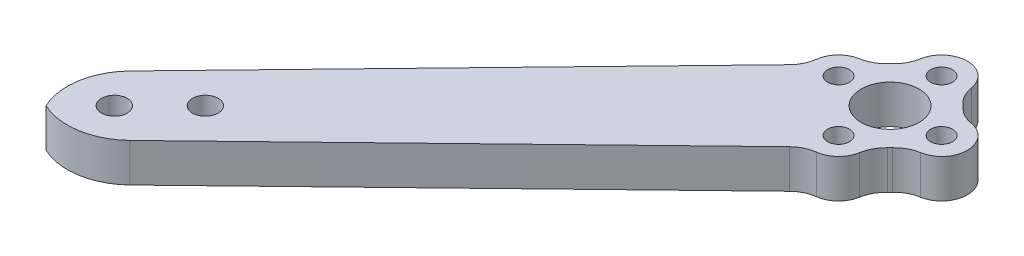
ISO-10303-21;
HEADER;
FILE_DESCRIPTION(('STEP AP214'),'2;1');
FILE_NAME('part.step','',(''),(''),'','','');
FILE_SCHEMA(('AUTOMOTIVE_DESIGN { 1 0 10303 214 1 1 1 1 }'));
ENDSEC;
DATA;
#1=APPLICATION_CONTEXT('core data for automotive mechanical design processes');
#2=APPLICATION_PROTOCOL_DEFINITION('international standard','automotive_design',2000,#1);
#3=PRODUCT_CONTEXT('',#1,'mechanical');
#4=PRODUCT('Part','Part','',(#3));
#5=PRODUCT_RELATED_PRODUCT_CATEGORY('part','',(#4));
#6=PRODUCT_DEFINITION_FORMATION('','',#4);
#7=PRODUCT_DEFINITION_CONTEXT('part definition',#1,'design');
#8=PRODUCT_DEFINITION('design','',#6,#7);
#9=PRODUCT_DEFINITION_SHAPE('','',#8);
#10=(LENGTH_UNIT() NAMED_UNIT(*) SI_UNIT(.MILLI.,.METRE.));
#11=(NAMED_UNIT(*) PLANE_ANGLE_UNIT() SI_UNIT($,.RADIAN.));
#12=(NAMED_UNIT(*) SI_UNIT($,.STERADIAN.) SOLID_ANGLE_UNIT());
#13=UNCERTAINTY_MEASURE_WITH_UNIT(LENGTH_MEASURE(1.E-05),#10,'distance_accuracy_value','');
#14=(GEOMETRIC_REPRESENTATION_CONTEXT(3) GLOBAL_UNCERTAINTY_ASSIGNED_CONTEXT((#13)) GLOBAL_UNIT_ASSIGNED_CONTEXT((#10,
#11,#12)) REPRESENTATION_CONTEXT('',''));
#15=CARTESIAN_POINT('',(0.,0.,0.));
#16=DIRECTION('',(0.,0.,1.));
#17=DIRECTION('',(1.,0.,0.));
#18=AXIS2_PLACEMENT_3D('',#15,#16,#17);
#19=CARTESIAN_POINT('',(94.5,6.,-93.8741196746495));
#20=DIRECTION('',(0.,-1.,0.));
#21=DIRECTION('',(0.,0.,-1.));
#22=AXIS2_PLACEMENT_3D('',#19,#20,#21);
#23=PLANE('',#22);
#24=CARTESIAN_POINT('',(24.7487373415292,6.,-24.7487373415292));
#25=DIRECTION('',(0.,1.,0.));
#26=DIRECTION('',(0.,0.,1.));
#27=AXIS2_PLACEMENT_3D('',#24,#25,#26);
#28=CIRCLE('',#27,2.);
#29=CARTESIAN_POINT('',(24.7487373415292,6.,-22.7487373415292));
#30=VERTEX_POINT('',#29);
#31=EDGE_CURVE('E235',#30,#30,#28,.T.);
#32=ORIENTED_EDGE('',*,*,#31,.F.);
#33=EDGE_LOOP('',(#32));
#34=FACE_BOUND('',#33,.T.);
#35=CARTESIAN_POINT('',(31.8198051533946,6.,-31.8198051533946));
#36=DIRECTION('',(0.,1.,0.));
#37=DIRECTION('',(0.,0.,1.));
#38=AXIS2_PLACEMENT_3D('',#35,#36,#37);
#39=CIRCLE('',#38,2.);
#40=CARTESIAN_POINT('',(31.8198051533946,6.,-29.8198051533946));
#41=VERTEX_POINT('',#40);
#42=EDGE_CURVE('E242',#41,#41,#39,.T.);
#43=ORIENTED_EDGE('',*,*,#42,.F.);
#44=EDGE_LOOP('',(#43));
#45=FACE_BOUND('',#44,.T.);
#46=CARTESIAN_POINT('',(28.4945148623447,6.,-23.6962252841413));
#47=DIRECTION('',(0.,-1.,0.));
#48=DIRECTION('',(0.,0.,-1.));
#49=AXIS2_PLACEMENT_3D('',#46,#47,#48);
#50=CIRCLE('',#49,10.);
#51=CARTESIAN_POINT('',(21.3078406424468,6.,-30.6497649336331));
#52=VERTEX_POINT('',#51);
#53=CARTESIAN_POINT('',(19.4437458895595,6.,-19.4437458895683));
#54=VERTEX_POINT('',#53);
#55=EDGE_CURVE('E65',#52,#54,#50,.F.);
#56=ORIENTED_EDGE('',*,*,#55,.T.);
#57=CARTESIAN_POINT('',(23.6962252841324,6.,-28.4945148623536));
#58=DIRECTION('',(0.,-1.,0.));
#59=DIRECTION('',(0.,0.,-1.));
#60=AXIS2_PLACEMENT_3D('',#57,#58,#59);
#61=CIRCLE('',#60,10.);
#62=CARTESIAN_POINT('',(30.6497649336229,6.,-21.3078406424544));
#63=VERTEX_POINT('',#62);
#64=EDGE_CURVE('E57',#54,#63,#61,.F.);
#65=ORIENTED_EDGE('',*,*,#64,.T.);
#66=DIRECTION('',(0.71866742198992,0.,-0.695353964949048));
#67=VECTOR('',#66,1.);
#68=CARTESIAN_POINT('',(82.7012290940619,6.,-71.6707635715978));
#69=LINE('',#68,#67);
#70=CARTESIAN_POINT('',(82.7012290940617,6.,-71.6707635715979));
#71=VERTEX_POINT('',#70);
#72=EDGE_CURVE('E312',#63,#71,#69,.T.);
#73=ORIENTED_EDGE('',*,*,#72,.T.);
#74=CARTESIAN_POINT('',(86.1779989188068,6.,-68.0774264616485));
#75=DIRECTION('',(0.,-1.,0.));
#76=DIRECTION('',(0.,0.,1.));
#77=AXIS2_PLACEMENT_3D('',#74,#75,#76);
#78=CIRCLE('',#77,4.99999999999975);
#79=CARTESIAN_POINT('',(85.5235550750253,6.,-73.0344117607327));
#80=VERTEX_POINT('',#79);
#81=EDGE_CURVE('E315',#71,#80,#78,.T.);
#82=ORIENTED_EDGE('',*,*,#81,.T.);
#83=CARTESIAN_POINT('',(85.,6.,-77.));
#84=DIRECTION('',(0.,1.,0.));
#85=DIRECTION('',(0.,0.,1.));
#86=AXIS2_PLACEMENT_3D('',#83,#84,#85);
#87=CIRCLE('',#86,4.00000000000002);
#88=CARTESIAN_POINT('',(88.9440531887331,6.,-76.3333333333334));
#89=VERTEX_POINT('',#88);
#90=EDGE_CURVE('E318',#80,#89,#87,.T.);
#91=ORIENTED_EDGE('',*,*,#90,.T.);
#92=CARTESIAN_POINT('',(93.8741196746494,6.,-75.5));
#93=DIRECTION('',(0.,-1.,0.));
#94=DIRECTION('',(0.,0.,1.));
#95=AXIS2_PLACEMENT_3D('',#92,#93,#94);
#96=CIRCLE('',#95,5.);
#97=CARTESIAN_POINT('',(90.4609967228612,6.,-79.1538461538462));
#98=VERTEX_POINT('',#97);
#99=EDGE_CURVE('E321',#89,#98,#96,.T.);
#100=ORIENTED_EDGE('',*,*,#99,.T.);
#101=CARTESIAN_POINT('',(85.,6.,-85.));
#102=DIRECTION('',(0.,1.,0.));
#103=DIRECTION('',(0.,0.,1.));
#104=AXIS2_PLACEMENT_3D('',#101,#102,#103);
#105=CIRCLE('',#104,8.);
#106=CARTESIAN_POINT('',(90.8461538461538,6.,-79.5390032771388));
#107=VERTEX_POINT('',#106);
#108=EDGE_CURVE('E324',#98,#107,#105,.T.);
#109=ORIENTED_EDGE('',*,*,#108,.T.);
#110=CARTESIAN_POINT('',(94.5,6.,-76.1258803253506));
#111=DIRECTION('',(0.,-1.,0.));
#112=DIRECTION('',(0.,0.,1.));
#113=AXIS2_PLACEMENT_3D('',#110,#111,#112);
#114=CIRCLE('',#113,5.);
#115=CARTESIAN_POINT('',(93.6666666666667,6.,-81.0559468112669));
#116=VERTEX_POINT('',#115);
#117=EDGE_CURVE('E327',#107,#116,#114,.T.);
#118=ORIENTED_EDGE('',*,*,#117,.T.);
#119=CARTESIAN_POINT('',(93.,6.,-85.));
#120=DIRECTION('',(0.,1.,0.));
#121=DIRECTION('',(0.,0.,1.));
#122=AXIS2_PLACEMENT_3D('',#119,#120,#121);
#123=CIRCLE('',#122,4.00000000000001);
#124=CARTESIAN_POINT('',(93.6666666666667,6.,-88.9440531887331));
#125=VERTEX_POINT('',#124);
#126=EDGE_CURVE('E197',#116,#125,#123,.T.);
#127=ORIENTED_EDGE('',*,*,#126,.T.);
#128=CARTESIAN_POINT('',(94.5,6.,-93.8741196746495));
#129=DIRECTION('',(0.,-1.,0.));
#130=DIRECTION('',(0.,0.,-1.));
#131=AXIS2_PLACEMENT_3D('',#128,#129,#130);
#132=CIRCLE('',#131,5.);
#133=CARTESIAN_POINT('',(90.8461538461539,6.,-90.4609967228612));
#134=VERTEX_POINT('',#133);
#135=EDGE_CURVE('E192',#125,#134,#132,.T.);
#136=ORIENTED_EDGE('',*,*,#135,.T.);
#137=CARTESIAN_POINT('',(85.,6.,-85.));
#138=DIRECTION('',(0.,1.,0.));
#139=DIRECTION('',(0.,0.,1.));
#140=AXIS2_PLACEMENT_3D('',#137,#138,#139);
#141=CIRCLE('',#140,8.);
#142=CARTESIAN_POINT('',(90.4609967228612,6.,-90.8461538461539));
#143=VERTEX_POINT('',#142);
#144=EDGE_CURVE('E181',#134,#143,#141,.T.);
#145=ORIENTED_EDGE('',*,*,#144,.T.);
#146=CARTESIAN_POINT('',(93.8741196746494,6.,-94.5));
#147=DIRECTION('',(0.,-1.,0.));
#148=DIRECTION('',(0.,0.,1.));
#149=AXIS2_PLACEMENT_3D('',#146,#147,#148);
#150=CIRCLE('',#149,5.);
#151=CARTESIAN_POINT('',(88.9440531887331,6.,-93.6666666666667));
#152=VERTEX_POINT('',#151);
#153=EDGE_CURVE('E191',#143,#152,#150,.T.);
#154=ORIENTED_EDGE('',*,*,#153,.T.);
#155=CARTESIAN_POINT('',(85.,6.,-93.));
#156=DIRECTION('',(0.,1.,0.));
#157=DIRECTION('',(0.,0.,1.));
#158=AXIS2_PLACEMENT_3D('',#155,#156,#157);
#159=CIRCLE('',#158,4.);
#160=CARTESIAN_POINT('',(81.055946811267,6.,-93.6666666666667));
#161=VERTEX_POINT('',#160);
#162=EDGE_CURVE('E291',#152,#161,#159,.T.);
#163=ORIENTED_EDGE('',*,*,#162,.T.);
#164=CARTESIAN_POINT('',(76.1258803253506,6.,-94.5));
#165=DIRECTION('',(0.,-1.,0.));
#166=DIRECTION('',(0.,0.,1.));
#167=AXIS2_PLACEMENT_3D('',#164,#165,#166);
#168=CIRCLE('',#167,5.00000000000004);
#169=CARTESIAN_POINT('',(79.5390032771388,6.,-90.8461538461539));
#170=VERTEX_POINT('',#169);
#171=EDGE_CURVE('E294',#161,#170,#168,.T.);
#172=ORIENTED_EDGE('',*,*,#171,.T.);
#173=CARTESIAN_POINT('',(85.,6.,-85.));
#174=DIRECTION('',(0.,1.,0.));
#175=DIRECTION('',(0.,0.,1.));
#176=AXIS2_PLACEMENT_3D('',#173,#174,#175);
#177=CIRCLE('',#176,7.99999999999997);
#178=CARTESIAN_POINT('',(79.1538461538461,6.,-90.4609967228609));
#179=VERTEX_POINT('',#178);
#180=EDGE_CURVE('E297',#170,#179,#177,.T.);
#181=ORIENTED_EDGE('',*,*,#180,.T.);
#182=CARTESIAN_POINT('',(75.5,6.,-93.8741196746495));
#183=DIRECTION('',(0.,-1.,0.));
#184=DIRECTION('',(0.,0.,1.));
#185=AXIS2_PLACEMENT_3D('',#182,#183,#184);
#186=CIRCLE('',#185,5.00000000000013);
#187=CARTESIAN_POINT('',(76.3333333333333,6.,-88.9440531887328));
#188=VERTEX_POINT('',#187);
#189=EDGE_CURVE('E300',#179,#188,#186,.T.);
#190=ORIENTED_EDGE('',*,*,#189,.T.);
#191=CARTESIAN_POINT('',(77.,6.,-85.));
#192=DIRECTION('',(0.,1.,0.));
#193=DIRECTION('',(0.,0.,1.));
#194=AXIS2_PLACEMENT_3D('',#191,#192,#193);
#195=CIRCLE('',#194,3.99999999999974);
#196=CARTESIAN_POINT('',(73.0344117607328,6.,-85.5235550750248));
#197=VERTEX_POINT('',#196);
#198=EDGE_CURVE('E303',#188,#197,#195,.T.);
#199=ORIENTED_EDGE('',*,*,#198,.T.);
#200=CARTESIAN_POINT('',(68.0774264616485,6.,-86.1779989188068));
#201=DIRECTION('',(0.,-1.,0.));
#202=DIRECTION('',(0.,0.,-1.));
#203=AXIS2_PLACEMENT_3D('',#200,#201,#202);
#204=CIRCLE('',#203,5.00000000000018);
#205=CARTESIAN_POINT('',(71.6707635715976,6.,-82.7012290940609));
#206=VERTEX_POINT('',#205);
#207=EDGE_CURVE('E306',#197,#206,#204,.T.);
#208=ORIENTED_EDGE('',*,*,#207,.T.);
#209=DIRECTION('',(-0.695353964949178,0.,0.718667421989795));
#210=VECTOR('',#209,1.);
#211=CARTESIAN_POINT('',(14.4680013583688,6.,-23.5806031643863));
#212=LINE('',#211,#210);
#213=EDGE_CURVE('E309',#206,#52,#212,.T.);
#214=ORIENTED_EDGE('',*,*,#213,.T.);
#215=EDGE_LOOP('',(#56,#65,#73,#82,#91,#100,#109,#118,#127,#136,#145,#154,#163,#172,#181,#190,
#199,#208,#214));
#216=FACE_BOUND('',#215,.T.);
#217=CARTESIAN_POINT('',(85.,6.,-93.));
#218=DIRECTION('',(0.,1.,0.));
#219=DIRECTION('',(0.,0.,1.));
#220=AXIS2_PLACEMENT_3D('',#217,#218,#219);
#221=CIRCLE('',#220,1.7);
#222=CARTESIAN_POINT('',(85.,6.,-91.3));
#223=VERTEX_POINT('',#222);
#224=EDGE_CURVE('E282',#223,#223,#221,.T.);
#225=ORIENTED_EDGE('',*,*,#224,.F.);
#226=EDGE_LOOP('',(#225));
#227=FACE_BOUND('',#226,.T.);
#228=CARTESIAN_POINT('',(93.,6.,-85.));
#229=DIRECTION('',(0.,1.,0.));
#230=DIRECTION('',(0.,0.,1.));
#231=AXIS2_PLACEMENT_3D('',#228,#229,#230);
#232=CIRCLE('',#231,1.7);
#233=CARTESIAN_POINT('',(93.,6.,-83.3));
#234=VERTEX_POINT('',#233);
#235=EDGE_CURVE('E274',#234,#234,#232,.T.);
#236=ORIENTED_EDGE('',*,*,#235,.F.);
#237=EDGE_LOOP('',(#236));
#238=FACE_BOUND('',#237,.T.);
#239=CARTESIAN_POINT('',(85.,6.,-77.));
#240=DIRECTION('',(0.,1.,0.));
#241=DIRECTION('',(0.,0.,1.));
#242=AXIS2_PLACEMENT_3D('',#239,#240,#241);
#243=CIRCLE('',#242,1.7);
#244=CARTESIAN_POINT('',(85.,6.,-75.3000000000001));
#245=VERTEX_POINT('',#244);
#246=EDGE_CURVE('E266',#245,#245,#243,.T.);
#247=ORIENTED_EDGE('',*,*,#246,.F.);
#248=EDGE_LOOP('',(#247));
#249=FACE_BOUND('',#248,.T.);
#250=CARTESIAN_POINT('',(77.,6.,-85.));
#251=DIRECTION('',(0.,1.,0.));
#252=DIRECTION('',(0.,0.,1.));
#253=AXIS2_PLACEMENT_3D('',#250,#251,#252);
#254=CIRCLE('',#253,1.7);
#255=CARTESIAN_POINT('',(77.,6.,-83.3));
#256=VERTEX_POINT('',#255);
#257=EDGE_CURVE('E258',#256,#256,#254,.T.);
#258=ORIENTED_EDGE('',*,*,#257,.F.);
#259=EDGE_LOOP('',(#258));
#260=FACE_BOUND('',#259,.T.);
#261=CARTESIAN_POINT('',(85.,6.,-85.));
#262=DIRECTION('',(0.,1.,0.));
#263=DIRECTION('',(0.,0.,1.));
#264=AXIS2_PLACEMENT_3D('',#261,#262,#263);
#265=CIRCLE('',#264,4.50000000000001);
#266=CARTESIAN_POINT('',(85.,6.,-80.5));
#267=VERTEX_POINT('',#266);
#268=EDGE_CURVE('E250',#267,#267,#265,.T.);
#269=ORIENTED_EDGE('',*,*,#268,.F.);
#270=EDGE_LOOP('',(#269));
#271=FACE_BOUND('',#270,.T.);
#272=ADVANCED_FACE('F47',(#34,#45,#216,#227,#238,#249,#260,#271),#23,.F.);
#273=CARTESIAN_POINT('',(94.5,0.,-93.8741196746495));
#274=DIRECTION('',(0.,-1.,0.));
#275=DIRECTION('',(0.,0.,-1.));
#276=AXIS2_PLACEMENT_3D('',#273,#274,#275);
#277=PLANE('',#276);
#278=CARTESIAN_POINT('',(24.7487373415292,0.,-24.7487373415292));
#279=DIRECTION('',(0.,-1.,0.));
#280=DIRECTION('',(0.,0.,-1.));
#281=AXIS2_PLACEMENT_3D('',#278,#279,#280);
#282=CIRCLE('',#281,2.);
#283=CARTESIAN_POINT('',(24.7487373415292,0.,-22.7487373415292));
#284=VERTEX_POINT('',#283);
#285=EDGE_CURVE('E51',#284,#284,#282,.T.);
#286=ORIENTED_EDGE('',*,*,#285,.F.);
#287=EDGE_LOOP('',(#286));
#288=FACE_BOUND('',#287,.T.);
#289=CARTESIAN_POINT('',(31.8198051533946,0.,-31.8198051533946));
#290=DIRECTION('',(0.,-1.,0.));
#291=DIRECTION('',(0.,0.,-1.));
#292=AXIS2_PLACEMENT_3D('',#289,#290,#291);
#293=CIRCLE('',#292,2.);
#294=CARTESIAN_POINT('',(31.8198051533946,0.,-29.8198051533946));
#295=VERTEX_POINT('',#294);
#296=EDGE_CURVE('E232',#295,#295,#293,.T.);
#297=ORIENTED_EDGE('',*,*,#296,.F.);
#298=EDGE_LOOP('',(#297));
#299=FACE_BOUND('',#298,.T.);
#300=CARTESIAN_POINT('',(77.,0.,-85.));
#301=DIRECTION('',(0.,1.,0.));
#302=DIRECTION('',(0.,0.,1.));
#303=AXIS2_PLACEMENT_3D('',#300,#301,#302);
#304=CIRCLE('',#303,1.7);
#305=CARTESIAN_POINT('',(77.,0.,-83.3));
#306=VERTEX_POINT('',#305);
#307=EDGE_CURVE('E254',#306,#306,#304,.T.);
#308=ORIENTED_EDGE('',*,*,#307,.T.);
#309=EDGE_LOOP('',(#308));
#310=FACE_BOUND('',#309,.T.);
#311=CARTESIAN_POINT('',(93.,0.,-85.));
#312=DIRECTION('',(0.,1.,0.));
#313=DIRECTION('',(0.,0.,1.));
#314=AXIS2_PLACEMENT_3D('',#311,#312,#313);
#315=CIRCLE('',#314,1.7);
#316=CARTESIAN_POINT('',(93.,0.,-83.3));
#317=VERTEX_POINT('',#316);
#318=EDGE_CURVE('E270',#317,#317,#315,.T.);
#319=ORIENTED_EDGE('',*,*,#318,.T.);
#320=EDGE_LOOP('',(#319));
#321=FACE_BOUND('',#320,.T.);
#322=DIRECTION('',(0.71866742198992,0.,-0.695353964949048));
#323=VECTOR('',#322,1.);
#324=CARTESIAN_POINT('',(82.7012290940619,0.,-71.6707635715978));
#325=LINE('',#324,#323);
#326=CARTESIAN_POINT('',(30.6497649336229,0.,-21.3078406424544));
#327=VERTEX_POINT('',#326);
#328=CARTESIAN_POINT('',(82.7012290940617,0.,-71.6707635715979));
#329=VERTEX_POINT('',#328);
#330=EDGE_CURVE('E362',#327,#329,#325,.T.);
#331=ORIENTED_EDGE('',*,*,#330,.F.);
#332=CARTESIAN_POINT('',(23.6962252841324,0.,-28.4945148623536));
#333=DIRECTION('',(0.,-1.,0.));
#334=DIRECTION('',(0.,0.,-1.));
#335=AXIS2_PLACEMENT_3D('',#332,#333,#334);
#336=CIRCLE('',#335,10.);
#337=CARTESIAN_POINT('',(19.4437458895595,0.,-19.4437458895683));
#338=VERTEX_POINT('',#337);
#339=EDGE_CURVE('E221',#327,#338,#336,.T.);
#340=ORIENTED_EDGE('',*,*,#339,.T.);
#341=CARTESIAN_POINT('',(28.4945148623447,0.,-23.6962252841413));
#342=DIRECTION('',(0.,-1.,0.));
#343=DIRECTION('',(0.,0.,-1.));
#344=AXIS2_PLACEMENT_3D('',#341,#342,#343);
#345=CIRCLE('',#344,10.);
#346=CARTESIAN_POINT('',(21.3078406424468,0.,-30.6497649336331));
#347=VERTEX_POINT('',#346);
#348=EDGE_CURVE('E213',#338,#347,#345,.T.);
#349=ORIENTED_EDGE('',*,*,#348,.T.);
#350=DIRECTION('',(-0.695353964949178,0.,0.718667421989795));
#351=VECTOR('',#350,1.);
#352=CARTESIAN_POINT('',(14.4680013583688,0.,-23.5806031643863));
#353=LINE('',#352,#351);
#354=CARTESIAN_POINT('',(71.6707635715976,0.,-82.7012290940609));
#355=VERTEX_POINT('',#354);
#356=EDGE_CURVE('E359',#355,#347,#353,.T.);
#357=ORIENTED_EDGE('',*,*,#356,.F.);
#358=CARTESIAN_POINT('',(68.0774264616485,0.,-86.1779989188068));
#359=DIRECTION('',(0.,-1.,0.));
#360=DIRECTION('',(0.,0.,-1.));
#361=AXIS2_PLACEMENT_3D('',#358,#359,#360);
#362=CIRCLE('',#361,5.00000000000018);
#363=CARTESIAN_POINT('',(73.0344117607328,0.,-85.5235550750248));
#364=VERTEX_POINT('',#363);
#365=EDGE_CURVE('E356',#364,#355,#362,.T.);
#366=ORIENTED_EDGE('',*,*,#365,.F.);
#367=CARTESIAN_POINT('',(77.,0.,-85.));
#368=DIRECTION('',(0.,1.,0.));
#369=DIRECTION('',(0.,0.,1.));
#370=AXIS2_PLACEMENT_3D('',#367,#368,#369);
#371=CIRCLE('',#370,3.99999999999974);
#372=CARTESIAN_POINT('',(76.3333333333333,0.,-88.9440531887328));
#373=VERTEX_POINT('',#372);
#374=EDGE_CURVE('E353',#373,#364,#371,.T.);
#375=ORIENTED_EDGE('',*,*,#374,.F.);
#376=CARTESIAN_POINT('',(75.5,0.,-93.8741196746495));
#377=DIRECTION('',(0.,-1.,0.));
#378=DIRECTION('',(0.,0.,1.));
#379=AXIS2_PLACEMENT_3D('',#376,#377,#378);
#380=CIRCLE('',#379,5.00000000000013);
#381=CARTESIAN_POINT('',(79.1538461538461,0.,-90.4609967228609));
#382=VERTEX_POINT('',#381);
#383=EDGE_CURVE('E350',#382,#373,#380,.T.);
#384=ORIENTED_EDGE('',*,*,#383,.F.);
#385=CARTESIAN_POINT('',(85.,0.,-85.));
#386=DIRECTION('',(0.,1.,0.));
#387=DIRECTION('',(0.,0.,1.));
#388=AXIS2_PLACEMENT_3D('',#385,#386,#387);
#389=CIRCLE('',#388,7.99999999999997);
#390=CARTESIAN_POINT('',(79.5390032771388,0.,-90.8461538461539));
#391=VERTEX_POINT('',#390);
#392=EDGE_CURVE('E347',#391,#382,#389,.T.);
#393=ORIENTED_EDGE('',*,*,#392,.F.);
#394=CARTESIAN_POINT('',(76.1258803253506,0.,-94.5));
#395=DIRECTION('',(0.,-1.,0.));
#396=DIRECTION('',(0.,0.,1.));
#397=AXIS2_PLACEMENT_3D('',#394,#395,#396);
#398=CIRCLE('',#397,5.00000000000004);
#399=CARTESIAN_POINT('',(81.055946811267,0.,-93.6666666666667));
#400=VERTEX_POINT('',#399);
#401=EDGE_CURVE('E344',#400,#391,#398,.T.);
#402=ORIENTED_EDGE('',*,*,#401,.F.);
#403=CARTESIAN_POINT('',(85.,0.,-93.));
#404=DIRECTION('',(0.,1.,0.));
#405=DIRECTION('',(0.,0.,1.));
#406=AXIS2_PLACEMENT_3D('',#403,#404,#405);
#407=CIRCLE('',#406,4.);
#408=CARTESIAN_POINT('',(88.9440531887331,0.,-93.6666666666667));
#409=VERTEX_POINT('',#408);
#410=EDGE_CURVE('E341',#409,#400,#407,.T.);
#411=ORIENTED_EDGE('',*,*,#410,.F.);
#412=CARTESIAN_POINT('',(93.8741196746494,0.,-94.5));
#413=DIRECTION('',(0.,-1.,0.));
#414=DIRECTION('',(0.,0.,1.));
#415=AXIS2_PLACEMENT_3D('',#412,#413,#414);
#416=CIRCLE('',#415,5.);
#417=CARTESIAN_POINT('',(90.4609967228612,0.,-90.8461538461539));
#418=VERTEX_POINT('',#417);
#419=EDGE_CURVE('E338',#418,#409,#416,.T.);
#420=ORIENTED_EDGE('',*,*,#419,.F.);
#421=CARTESIAN_POINT('',(85.,0.,-85.));
#422=DIRECTION('',(0.,1.,0.));
#423=DIRECTION('',(0.,0.,1.));
#424=AXIS2_PLACEMENT_3D('',#421,#422,#423);
#425=CIRCLE('',#424,8.);
#426=CARTESIAN_POINT('',(90.8461538461539,0.,-90.4609967228612));
#427=VERTEX_POINT('',#426);
#428=EDGE_CURVE('E335',#427,#418,#425,.T.);
#429=ORIENTED_EDGE('',*,*,#428,.F.);
#430=CARTESIAN_POINT('',(94.5,0.,-93.8741196746495));
#431=DIRECTION('',(0.,-1.,0.));
#432=DIRECTION('',(0.,0.,-1.));
#433=AXIS2_PLACEMENT_3D('',#430,#431,#432);
#434=CIRCLE('',#433,5.);
#435=CARTESIAN_POINT('',(93.6666666666667,0.,-88.9440531887331));
#436=VERTEX_POINT('',#435);
#437=EDGE_CURVE('E206',#436,#427,#434,.T.);
#438=ORIENTED_EDGE('',*,*,#437,.F.);
#439=CARTESIAN_POINT('',(93.,0.,-85.));
#440=DIRECTION('',(0.,1.,0.));
#441=DIRECTION('',(0.,0.,1.));
#442=AXIS2_PLACEMENT_3D('',#439,#440,#441);
#443=CIRCLE('',#442,4.00000000000001);
#444=CARTESIAN_POINT('',(93.6666666666667,0.,-81.0559468112669));
#445=VERTEX_POINT('',#444);
#446=EDGE_CURVE('E202',#445,#436,#443,.T.);
#447=ORIENTED_EDGE('',*,*,#446,.F.);
#448=CARTESIAN_POINT('',(94.5,0.,-76.1258803253506));
#449=DIRECTION('',(0.,-1.,0.));
#450=DIRECTION('',(0.,0.,1.));
#451=AXIS2_PLACEMENT_3D('',#448,#449,#450);
#452=CIRCLE('',#451,5.);
#453=CARTESIAN_POINT('',(90.8461538461538,0.,-79.5390032771388));
#454=VERTEX_POINT('',#453);
#455=EDGE_CURVE('E377',#454,#445,#452,.T.);
#456=ORIENTED_EDGE('',*,*,#455,.F.);
#457=CARTESIAN_POINT('',(85.,0.,-85.));
#458=DIRECTION('',(0.,1.,0.));
#459=DIRECTION('',(0.,0.,1.));
#460=AXIS2_PLACEMENT_3D('',#457,#458,#459);
#461=CIRCLE('',#460,8.);
#462=CARTESIAN_POINT('',(90.4609967228612,0.,-79.1538461538462));
#463=VERTEX_POINT('',#462);
#464=EDGE_CURVE('E374',#463,#454,#461,.T.);
#465=ORIENTED_EDGE('',*,*,#464,.F.);
#466=CARTESIAN_POINT('',(93.8741196746494,0.,-75.5));
#467=DIRECTION('',(0.,-1.,0.));
#468=DIRECTION('',(0.,0.,1.));
#469=AXIS2_PLACEMENT_3D('',#466,#467,#468);
#470=CIRCLE('',#469,5.);
#471=CARTESIAN_POINT('',(88.9440531887331,0.,-76.3333333333334));
#472=VERTEX_POINT('',#471);
#473=EDGE_CURVE('E371',#472,#463,#470,.T.);
#474=ORIENTED_EDGE('',*,*,#473,.F.);
#475=CARTESIAN_POINT('',(85.,0.,-77.));
#476=DIRECTION('',(0.,1.,0.));
#477=DIRECTION('',(0.,0.,1.));
#478=AXIS2_PLACEMENT_3D('',#475,#476,#477);
#479=CIRCLE('',#478,4.00000000000002);
#480=CARTESIAN_POINT('',(85.5235550750253,0.,-73.0344117607327));
#481=VERTEX_POINT('',#480);
#482=EDGE_CURVE('E368',#481,#472,#479,.T.);
#483=ORIENTED_EDGE('',*,*,#482,.F.);
#484=CARTESIAN_POINT('',(86.1779989188068,0.,-68.0774264616485));
#485=DIRECTION('',(0.,-1.,0.));
#486=DIRECTION('',(0.,0.,1.));
#487=AXIS2_PLACEMENT_3D('',#484,#485,#486);
#488=CIRCLE('',#487,4.99999999999975);
#489=EDGE_CURVE('E365',#329,#481,#488,.T.);
#490=ORIENTED_EDGE('',*,*,#489,.F.);
#491=EDGE_LOOP('',(#331,#340,#349,#357,#366,#375,#384,#393,#402,#411,#420,#429,#438,#447,#456,
#465,#474,#483,#490));
#492=FACE_BOUND('',#491,.T.);
#493=CARTESIAN_POINT('',(85.,0.,-93.));
#494=DIRECTION('',(0.,1.,0.));
#495=DIRECTION('',(0.,0.,1.));
#496=AXIS2_PLACEMENT_3D('',#493,#494,#495);
#497=CIRCLE('',#496,1.7);
#498=CARTESIAN_POINT('',(85.,0.,-91.3));
#499=VERTEX_POINT('',#498);
#500=EDGE_CURVE('E278',#499,#499,#497,.T.);
#501=ORIENTED_EDGE('',*,*,#500,.T.);
#502=EDGE_LOOP('',(#501));
#503=FACE_BOUND('',#502,.T.);
#504=CARTESIAN_POINT('',(85.,0.,-77.));
#505=DIRECTION('',(0.,1.,0.));
#506=DIRECTION('',(0.,0.,1.));
#507=AXIS2_PLACEMENT_3D('',#504,#505,#506);
#508=CIRCLE('',#507,1.7);
#509=CARTESIAN_POINT('',(85.,0.,-75.3000000000001));
#510=VERTEX_POINT('',#509);
#511=EDGE_CURVE('E262',#510,#510,#508,.T.);
#512=ORIENTED_EDGE('',*,*,#511,.T.);
#513=EDGE_LOOP('',(#512));
#514=FACE_BOUND('',#513,.T.);
#515=CARTESIAN_POINT('',(85.,0.,-85.));
#516=DIRECTION('',(0.,1.,0.));
#517=DIRECTION('',(0.,0.,1.));
#518=AXIS2_PLACEMENT_3D('',#515,#516,#517);
#519=CIRCLE('',#518,4.50000000000001);
#520=CARTESIAN_POINT('',(85.,0.,-80.5));
#521=VERTEX_POINT('',#520);
#522=EDGE_CURVE('E231',#521,#521,#519,.T.);
#523=ORIENTED_EDGE('',*,*,#522,.T.);
#524=EDGE_LOOP('',(#523));
#525=FACE_BOUND('',#524,.T.);
#526=ADVANCED_FACE('F444',(#288,#299,#310,#321,#492,#503,#514,#525),#277,.T.);
#527=CARTESIAN_POINT('',(94.5,6.,-93.8741196746495));
#528=DIRECTION('',(0.,-1.,0.));
#529=DIRECTION('',(0.,0.,-1.));
#530=AXIS2_PLACEMENT_3D('',#527,#528,#529);
#531=CYLINDRICAL_SURFACE('',#530,5.);
#532=ORIENTED_EDGE('',*,*,#437,.T.);
#533=DIRECTION('',(0.,-1.,0.));
#534=VECTOR('',#533,1.);
#535=CARTESIAN_POINT('',(90.8461538461539,6.,-90.4609967228612));
#536=LINE('',#535,#534);
#537=EDGE_CURVE('E185',#134,#427,#536,.T.);
#538=ORIENTED_EDGE('',*,*,#537,.F.);
#539=ORIENTED_EDGE('',*,*,#135,.F.);
#540=DIRECTION('',(0.,-1.,0.));
#541=VECTOR('',#540,1.);
#542=CARTESIAN_POINT('',(93.6666666666667,6.,-88.9440531887331));
#543=LINE('',#542,#541);
#544=EDGE_CURVE('E332',#125,#436,#543,.T.);
#545=ORIENTED_EDGE('',*,*,#544,.T.);
#546=EDGE_LOOP('',(#532,#538,#539,#545));
#547=FACE_BOUND('',#546,.T.);
#548=ADVANCED_FACE('F204',(#547),#531,.F.);
#549=CARTESIAN_POINT('',(85.,6.,-85.));
#550=DIRECTION('',(0.,-1.,0.));
#551=DIRECTION('',(0.,0.,-1.));
#552=AXIS2_PLACEMENT_3D('',#549,#550,#551);
#553=CYLINDRICAL_SURFACE('',#552,8.);
#554=ORIENTED_EDGE('',*,*,#428,.T.);
#555=DIRECTION('',(0.,-1.,0.));
#556=VECTOR('',#555,1.);
#557=CARTESIAN_POINT('',(90.4609967228612,6.,-90.8461538461539));
#558=LINE('',#557,#556);
#559=EDGE_CURVE('E188',#143,#418,#558,.T.);
#560=ORIENTED_EDGE('',*,*,#559,.F.);
#561=ORIENTED_EDGE('',*,*,#144,.F.);
#562=ORIENTED_EDGE('',*,*,#537,.T.);
#563=EDGE_LOOP('',(#554,#560,#561,#562));
#564=FACE_BOUND('',#563,.T.);
#565=ADVANCED_FACE('F183',(#564),#553,.T.);
#566=CARTESIAN_POINT('',(93.8741196746494,6.,-94.5));
#567=DIRECTION('',(0.,-1.,0.));
#568=DIRECTION('',(0.,0.,-1.));
#569=AXIS2_PLACEMENT_3D('',#566,#567,#568);
#570=CYLINDRICAL_SURFACE('',#569,5.);
#571=ORIENTED_EDGE('',*,*,#419,.T.);
#572=DIRECTION('',(0.,-1.,0.));
#573=VECTOR('',#572,1.);
#574=CARTESIAN_POINT('',(88.9440531887331,6.,-93.6666666666667));
#575=LINE('',#574,#573);
#576=EDGE_CURVE('E215',#152,#409,#575,.T.);
#577=ORIENTED_EDGE('',*,*,#576,.F.);
#578=ORIENTED_EDGE('',*,*,#153,.F.);
#579=ORIENTED_EDGE('',*,*,#559,.T.);
#580=EDGE_LOOP('',(#571,#577,#578,#579));
#581=FACE_BOUND('',#580,.T.);
#582=ADVANCED_FACE('F458',(#581),#570,.F.);
#583=CARTESIAN_POINT('',(85.,6.,-93.));
#584=DIRECTION('',(0.,-1.,0.));
#585=DIRECTION('',(0.,0.,-1.));
#586=AXIS2_PLACEMENT_3D('',#583,#584,#585);
#587=CYLINDRICAL_SURFACE('',#586,4.);
#588=ORIENTED_EDGE('',*,*,#410,.T.);
#589=DIRECTION('',(0.,-1.,0.));
#590=VECTOR('',#589,1.);
#591=CARTESIAN_POINT('',(81.055946811267,6.,-93.6666666666667));
#592=LINE('',#591,#590);
#593=EDGE_CURVE('E428',#161,#400,#592,.T.);
#594=ORIENTED_EDGE('',*,*,#593,.F.);
#595=ORIENTED_EDGE('',*,*,#162,.F.);
#596=ORIENTED_EDGE('',*,*,#576,.T.);
#597=EDGE_LOOP('',(#588,#594,#595,#596));
#598=FACE_BOUND('',#597,.T.);
#599=ADVANCED_FACE('F437',(#598),#587,.T.);
#600=CARTESIAN_POINT('',(76.1258803253506,6.,-94.5));
#601=DIRECTION('',(0.,-1.,0.));
#602=DIRECTION('',(0.,0.,-1.));
#603=AXIS2_PLACEMENT_3D('',#600,#601,#602);
#604=CYLINDRICAL_SURFACE('',#603,5.00000000000004);
#605=ORIENTED_EDGE('',*,*,#401,.T.);
#606=DIRECTION('',(0.,-1.,0.));
#607=VECTOR('',#606,1.);
#608=CARTESIAN_POINT('',(79.5390032771388,6.,-90.8461538461539));
#609=LINE('',#608,#607);
#610=EDGE_CURVE('E424',#170,#391,#609,.T.);
#611=ORIENTED_EDGE('',*,*,#610,.F.);
#612=ORIENTED_EDGE('',*,*,#171,.F.);
#613=ORIENTED_EDGE('',*,*,#593,.T.);
#614=EDGE_LOOP('',(#605,#611,#612,#613));
#615=FACE_BOUND('',#614,.T.);
#616=ADVANCED_FACE('F450',(#615),#604,.F.);
#617=CARTESIAN_POINT('',(85.,6.,-85.));
#618=DIRECTION('',(0.,-1.,0.));
#619=DIRECTION('',(0.,0.,-1.));
#620=AXIS2_PLACEMENT_3D('',#617,#618,#619);
#621=CYLINDRICAL_SURFACE('',#620,7.99999999999997);
#622=ORIENTED_EDGE('',*,*,#392,.T.);
#623=DIRECTION('',(0.,-1.,0.));
#624=VECTOR('',#623,1.);
#625=CARTESIAN_POINT('',(79.1538461538461,6.,-90.4609967228609));
#626=LINE('',#625,#624);
#627=EDGE_CURVE('E420',#179,#382,#626,.T.);
#628=ORIENTED_EDGE('',*,*,#627,.F.);
#629=ORIENTED_EDGE('',*,*,#180,.F.);
#630=ORIENTED_EDGE('',*,*,#610,.T.);
#631=EDGE_LOOP('',(#622,#628,#629,#630));
#632=FACE_BOUND('',#631,.T.);
#633=ADVANCED_FACE('F454',(#632),#621,.T.);
#634=CARTESIAN_POINT('',(75.5,6.,-93.8741196746495));
#635=DIRECTION('',(0.,-1.,0.));
#636=DIRECTION('',(0.,0.,-1.));
#637=AXIS2_PLACEMENT_3D('',#634,#635,#636);
#638=CYLINDRICAL_SURFACE('',#637,5.00000000000013);
#639=ORIENTED_EDGE('',*,*,#383,.T.);
#640=DIRECTION('',(0.,-1.,0.));
#641=VECTOR('',#640,1.);
#642=CARTESIAN_POINT('',(76.3333333333333,6.,-88.9440531887328));
#643=LINE('',#642,#641);
#644=EDGE_CURVE('E416',#188,#373,#643,.T.);
#645=ORIENTED_EDGE('',*,*,#644,.F.);
#646=ORIENTED_EDGE('',*,*,#189,.F.);
#647=ORIENTED_EDGE('',*,*,#627,.T.);
#648=EDGE_LOOP('',(#639,#645,#646,#647));
#649=FACE_BOUND('',#648,.T.);
#650=ADVANCED_FACE('F519',(#649),#638,.F.);
#651=CARTESIAN_POINT('',(77.,6.,-85.));
#652=DIRECTION('',(0.,-1.,0.));
#653=DIRECTION('',(0.,0.,-1.));
#654=AXIS2_PLACEMENT_3D('',#651,#652,#653);
#655=CYLINDRICAL_SURFACE('',#654,3.99999999999974);
#656=ORIENTED_EDGE('',*,*,#374,.T.);
#657=DIRECTION('',(0.,-1.,0.));
#658=VECTOR('',#657,1.);
#659=CARTESIAN_POINT('',(73.0344117607328,6.,-85.5235550750248));
#660=LINE('',#659,#658);
#661=EDGE_CURVE('E412',#197,#364,#660,.T.);
#662=ORIENTED_EDGE('',*,*,#661,.F.);
#663=ORIENTED_EDGE('',*,*,#198,.F.);
#664=ORIENTED_EDGE('',*,*,#644,.T.);
#665=EDGE_LOOP('',(#656,#662,#663,#664));
#666=FACE_BOUND('',#665,.T.);
#667=ADVANCED_FACE('F515',(#666),#655,.T.);
#668=CARTESIAN_POINT('',(68.0774264616485,6.,-86.1779989188068));
#669=DIRECTION('',(0.,-1.,0.));
#670=DIRECTION('',(0.,0.,-1.));
#671=AXIS2_PLACEMENT_3D('',#668,#669,#670);
#672=CYLINDRICAL_SURFACE('',#671,5.00000000000018);
#673=ORIENTED_EDGE('',*,*,#365,.T.);
#674=DIRECTION('',(0.,-1.,0.));
#675=VECTOR('',#674,1.);
#676=CARTESIAN_POINT('',(71.6707635715976,6.,-82.7012290940609));
#677=LINE('',#676,#675);
#678=EDGE_CURVE('E408',#206,#355,#677,.T.);
#679=ORIENTED_EDGE('',*,*,#678,.F.);
#680=ORIENTED_EDGE('',*,*,#207,.F.);
#681=ORIENTED_EDGE('',*,*,#661,.T.);
#682=EDGE_LOOP('',(#673,#679,#680,#681));
#683=FACE_BOUND('',#682,.T.);
#684=ADVANCED_FACE('F512',(#683),#672,.F.);
#685=CARTESIAN_POINT('',(14.4680013583688,6.,-23.5806031643863));
#686=DIRECTION('',(0.718667421989795,0.,0.695353964949178));
#687=DIRECTION('',(0.695353964949178,0.,-0.718667421989795));
#688=AXIS2_PLACEMENT_3D('',#685,#686,#687);
#689=PLANE('',#688);
#690=ORIENTED_EDGE('',*,*,#356,.T.);
#691=DIRECTION('',(0.,-1.,0.));
#692=VECTOR('',#691,1.);
#693=CARTESIAN_POINT('',(21.3078406424468,6.,-30.6497649336331));
#694=LINE('',#693,#692);
#695=EDGE_CURVE('E11',#347,#52,#694,.F.);
#696=ORIENTED_EDGE('',*,*,#695,.T.);
#697=ORIENTED_EDGE('',*,*,#213,.F.);
#698=ORIENTED_EDGE('',*,*,#678,.T.);
#699=EDGE_LOOP('',(#690,#696,#697,#698));
#700=FACE_BOUND('',#699,.T.);
#701=ADVANCED_FACE('F508',(#700),#689,.F.);
#702=CARTESIAN_POINT('',(82.7012290940619,6.,-71.6707635715978));
#703=DIRECTION('',(-0.695353964949048,0.,-0.71866742198992));
#704=DIRECTION('',(-0.71866742198992,0.,0.695353964949048));
#705=AXIS2_PLACEMENT_3D('',#702,#703,#704);
#706=PLANE('',#705);
#707=ORIENTED_EDGE('',*,*,#72,.F.);
#708=DIRECTION('',(0.,-1.,0.));
#709=VECTOR('',#708,1.);
#710=CARTESIAN_POINT('',(30.6497649336229,6.,-21.3078406424544));
#711=LINE('',#710,#709);
#712=EDGE_CURVE('E208',#63,#327,#711,.T.);
#713=ORIENTED_EDGE('',*,*,#712,.T.);
#714=ORIENTED_EDGE('',*,*,#330,.T.);
#715=DIRECTION('',(0.,-1.,0.));
#716=VECTOR('',#715,1.);
#717=CARTESIAN_POINT('',(82.7012290940617,6.,-71.6707635715979));
#718=LINE('',#717,#716);
#719=EDGE_CURVE('E404',#71,#329,#718,.T.);
#720=ORIENTED_EDGE('',*,*,#719,.F.);
#721=EDGE_LOOP('',(#707,#713,#714,#720));
#722=FACE_BOUND('',#721,.T.);
#723=ADVANCED_FACE('F504',(#722),#706,.F.);
#724=CARTESIAN_POINT('',(86.1779989188068,6.,-68.0774264616485));
#725=DIRECTION('',(0.,-1.,0.));
#726=DIRECTION('',(0.,0.,-1.));
#727=AXIS2_PLACEMENT_3D('',#724,#725,#726);
#728=CYLINDRICAL_SURFACE('',#727,4.99999999999975);
#729=ORIENTED_EDGE('',*,*,#489,.T.);
#730=DIRECTION('',(0.,-1.,0.));
#731=VECTOR('',#730,1.);
#732=CARTESIAN_POINT('',(85.5235550750253,6.,-73.0344117607327));
#733=LINE('',#732,#731);
#734=EDGE_CURVE('E400',#80,#481,#733,.T.);
#735=ORIENTED_EDGE('',*,*,#734,.F.);
#736=ORIENTED_EDGE('',*,*,#81,.F.);
#737=ORIENTED_EDGE('',*,*,#719,.T.);
#738=EDGE_LOOP('',(#729,#735,#736,#737));
#739=FACE_BOUND('',#738,.T.);
#740=ADVANCED_FACE('F500',(#739),#728,.F.);
#741=CARTESIAN_POINT('',(85.,6.,-77.));
#742=DIRECTION('',(0.,-1.,0.));
#743=DIRECTION('',(0.,0.,-1.));
#744=AXIS2_PLACEMENT_3D('',#741,#742,#743);
#745=CYLINDRICAL_SURFACE('',#744,4.00000000000002);
#746=ORIENTED_EDGE('',*,*,#482,.T.);
#747=DIRECTION('',(0.,-1.,0.));
#748=VECTOR('',#747,1.);
#749=CARTESIAN_POINT('',(88.9440531887331,6.,-76.3333333333334));
#750=LINE('',#749,#748);
#751=EDGE_CURVE('E396',#89,#472,#750,.T.);
#752=ORIENTED_EDGE('',*,*,#751,.F.);
#753=ORIENTED_EDGE('',*,*,#90,.F.);
#754=ORIENTED_EDGE('',*,*,#734,.T.);
#755=EDGE_LOOP('',(#746,#752,#753,#754));
#756=FACE_BOUND('',#755,.T.);
#757=ADVANCED_FACE('F496',(#756),#745,.T.);
#758=CARTESIAN_POINT('',(93.8741196746494,6.,-75.5));
#759=DIRECTION('',(0.,-1.,0.));
#760=DIRECTION('',(0.,0.,-1.));
#761=AXIS2_PLACEMENT_3D('',#758,#759,#760);
#762=CYLINDRICAL_SURFACE('',#761,5.);
#763=ORIENTED_EDGE('',*,*,#473,.T.);
#764=DIRECTION('',(0.,-1.,0.));
#765=VECTOR('',#764,1.);
#766=CARTESIAN_POINT('',(90.4609967228612,6.,-79.1538461538462));
#767=LINE('',#766,#765);
#768=EDGE_CURVE('E392',#98,#463,#767,.T.);
#769=ORIENTED_EDGE('',*,*,#768,.F.);
#770=ORIENTED_EDGE('',*,*,#99,.F.);
#771=ORIENTED_EDGE('',*,*,#751,.T.);
#772=EDGE_LOOP('',(#763,#769,#770,#771));
#773=FACE_BOUND('',#772,.T.);
#774=ADVANCED_FACE('F492',(#773),#762,.F.);
#775=CARTESIAN_POINT('',(85.,6.,-85.));
#776=DIRECTION('',(0.,-1.,0.));
#777=DIRECTION('',(0.,0.,-1.));
#778=AXIS2_PLACEMENT_3D('',#775,#776,#777);
#779=CYLINDRICAL_SURFACE('',#778,8.);
#780=ORIENTED_EDGE('',*,*,#464,.T.);
#781=DIRECTION('',(0.,-1.,0.));
#782=VECTOR('',#781,1.);
#783=CARTESIAN_POINT('',(90.8461538461538,6.,-79.5390032771388));
#784=LINE('',#783,#782);
#785=EDGE_CURVE('E388',#107,#454,#784,.T.);
#786=ORIENTED_EDGE('',*,*,#785,.F.);
#787=ORIENTED_EDGE('',*,*,#108,.F.);
#788=ORIENTED_EDGE('',*,*,#768,.T.);
#789=EDGE_LOOP('',(#780,#786,#787,#788));
#790=FACE_BOUND('',#789,.T.);
#791=ADVANCED_FACE('F488',(#790),#779,.T.);
#792=CARTESIAN_POINT('',(94.5,6.,-76.1258803253506));
#793=DIRECTION('',(0.,-1.,0.));
#794=DIRECTION('',(0.,0.,-1.));
#795=AXIS2_PLACEMENT_3D('',#792,#793,#794);
#796=CYLINDRICAL_SURFACE('',#795,5.);
#797=ORIENTED_EDGE('',*,*,#455,.T.);
#798=DIRECTION('',(0.,-1.,0.));
#799=VECTOR('',#798,1.);
#800=CARTESIAN_POINT('',(93.6666666666667,6.,-81.0559468112669));
#801=LINE('',#800,#799);
#802=EDGE_CURVE('E384',#116,#445,#801,.T.);
#803=ORIENTED_EDGE('',*,*,#802,.F.);
#804=ORIENTED_EDGE('',*,*,#117,.F.);
#805=ORIENTED_EDGE('',*,*,#785,.T.);
#806=EDGE_LOOP('',(#797,#803,#804,#805));
#807=FACE_BOUND('',#806,.T.);
#808=ADVANCED_FACE('F484',(#807),#796,.F.);
#809=CARTESIAN_POINT('',(93.,6.,-85.));
#810=DIRECTION('',(0.,-1.,0.));
#811=DIRECTION('',(0.,0.,-1.));
#812=AXIS2_PLACEMENT_3D('',#809,#810,#811);
#813=CYLINDRICAL_SURFACE('',#812,4.00000000000001);
#814=ORIENTED_EDGE('',*,*,#446,.T.);
#815=ORIENTED_EDGE('',*,*,#544,.F.);
#816=ORIENTED_EDGE('',*,*,#126,.F.);
#817=ORIENTED_EDGE('',*,*,#802,.T.);
#818=EDGE_LOOP('',(#814,#815,#816,#817));
#819=FACE_BOUND('',#818,.T.);
#820=ADVANCED_FACE('F481',(#819),#813,.T.);
#821=CARTESIAN_POINT('',(85.,6.,-93.));
#822=DIRECTION('',(0.,-1.,0.));
#823=DIRECTION('',(0.,0.,-1.));
#824=AXIS2_PLACEMENT_3D('',#821,#822,#823);
#825=CYLINDRICAL_SURFACE('',#824,1.7);
#826=ORIENTED_EDGE('',*,*,#224,.T.);
#827=EDGE_LOOP('',(#826));
#828=FACE_BOUND('',#827,.T.);
#829=ORIENTED_EDGE('',*,*,#500,.F.);
#830=EDGE_LOOP('',(#829));
#831=FACE_BOUND('',#830,.T.);
#832=ADVANCED_FACE('F478',(#828,#831),#825,.F.);
#833=CARTESIAN_POINT('',(93.,6.,-85.));
#834=DIRECTION('',(0.,-1.,0.));
#835=DIRECTION('',(0.,0.,-1.));
#836=AXIS2_PLACEMENT_3D('',#833,#834,#835);
#837=CYLINDRICAL_SURFACE('',#836,1.7);
#838=ORIENTED_EDGE('',*,*,#235,.T.);
#839=EDGE_LOOP('',(#838));
#840=FACE_BOUND('',#839,.T.);
#841=ORIENTED_EDGE('',*,*,#318,.F.);
#842=EDGE_LOOP('',(#841));
#843=FACE_BOUND('',#842,.T.);
#844=ADVANCED_FACE('F590',(#840,#843),#837,.F.);
#845=CARTESIAN_POINT('',(85.,6.,-77.));
#846=DIRECTION('',(0.,-1.,0.));
#847=DIRECTION('',(0.,0.,-1.));
#848=AXIS2_PLACEMENT_3D('',#845,#846,#847);
#849=CYLINDRICAL_SURFACE('',#848,1.7);
#850=ORIENTED_EDGE('',*,*,#246,.T.);
#851=EDGE_LOOP('',(#850));
#852=FACE_BOUND('',#851,.T.);
#853=ORIENTED_EDGE('',*,*,#511,.F.);
#854=EDGE_LOOP('',(#853));
#855=FACE_BOUND('',#854,.T.);
#856=ADVANCED_FACE('F598',(#852,#855),#849,.F.);
#857=CARTESIAN_POINT('',(77.,6.,-85.));
#858=DIRECTION('',(0.,-1.,0.));
#859=DIRECTION('',(0.,0.,-1.));
#860=AXIS2_PLACEMENT_3D('',#857,#858,#859);
#861=CYLINDRICAL_SURFACE('',#860,1.7);
#862=ORIENTED_EDGE('',*,*,#257,.T.);
#863=EDGE_LOOP('',(#862));
#864=FACE_BOUND('',#863,.T.);
#865=ORIENTED_EDGE('',*,*,#307,.F.);
#866=EDGE_LOOP('',(#865));
#867=FACE_BOUND('',#866,.T.);
#868=ADVANCED_FACE('F606',(#864,#867),#861,.F.);
#869=CARTESIAN_POINT('',(85.,6.,-85.));
#870=DIRECTION('',(0.,-1.,0.));
#871=DIRECTION('',(0.,0.,-1.));
#872=AXIS2_PLACEMENT_3D('',#869,#870,#871);
#873=CYLINDRICAL_SURFACE('',#872,4.50000000000001);
#874=ORIENTED_EDGE('',*,*,#268,.T.);
#875=EDGE_LOOP('',(#874));
#876=FACE_BOUND('',#875,.T.);
#877=ORIENTED_EDGE('',*,*,#522,.F.);
#878=EDGE_LOOP('',(#877));
#879=FACE_BOUND('',#878,.T.);
#880=ADVANCED_FACE('F615',(#876,#879),#873,.F.);
#881=CARTESIAN_POINT('',(28.4945148623447,6.,-23.6962252841413));
#882=DIRECTION('',(0.,-1.,0.));
#883=DIRECTION('',(0.,0.,-1.));
#884=AXIS2_PLACEMENT_3D('',#881,#882,#883);
#885=CYLINDRICAL_SURFACE('',#884,10.);
#886=DIRECTION('',(0.,-1.,0.));
#887=VECTOR('',#886,1.);
#888=CARTESIAN_POINT('',(19.4437458895595,3.,-19.4437458895683));
#889=LINE('',#888,#887);
#890=EDGE_CURVE('E228',#54,#338,#889,.T.);
#891=ORIENTED_EDGE('',*,*,#890,.F.);
#892=ORIENTED_EDGE('',*,*,#55,.F.);
#893=ORIENTED_EDGE('',*,*,#695,.F.);
#894=ORIENTED_EDGE('',*,*,#348,.F.);
#895=EDGE_LOOP('',(#891,#892,#893,#894));
#896=FACE_BOUND('',#895,.T.);
#897=ADVANCED_FACE('F49',(#896),#885,.T.);
#898=CARTESIAN_POINT('',(23.6962252841324,6.,-28.4945148623536));
#899=DIRECTION('',(0.,-1.,0.));
#900=DIRECTION('',(0.,0.,-1.));
#901=AXIS2_PLACEMENT_3D('',#898,#899,#900);
#902=CYLINDRICAL_SURFACE('',#901,10.);
#903=ORIENTED_EDGE('',*,*,#64,.F.);
#904=ORIENTED_EDGE('',*,*,#890,.T.);
#905=ORIENTED_EDGE('',*,*,#339,.F.);
#906=ORIENTED_EDGE('',*,*,#712,.F.);
#907=EDGE_LOOP('',(#903,#904,#905,#906));
#908=FACE_BOUND('',#907,.T.);
#909=ADVANCED_FACE('F639',(#908),#902,.T.);
#910=CARTESIAN_POINT('',(31.8198051533946,-1.2E-05,-31.8198051533946));
#911=DIRECTION('',(0.,1.,0.));
#912=DIRECTION('',(0.,0.,1.));
#913=AXIS2_PLACEMENT_3D('',#910,#911,#912);
#914=CYLINDRICAL_SURFACE('',#913,2.);
#915=CARTESIAN_POINT('',(31.8198051533946,0.,-29.8198051533946));
#916=CARTESIAN_POINT('',(31.8198051533946,0.0624999999999999,-29.8198051533946));
#917=CARTESIAN_POINT('',(31.8198051533946,0.125,-29.8198051533946));
#918=CARTESIAN_POINT('',(31.8198051533946,0.25,-29.8198051533946));
#919=CARTESIAN_POINT('',(31.8198051533946,0.3125,-29.8198051533946));
#920=CARTESIAN_POINT('',(31.8198051533946,0.4375,-29.8198051533946));
#921=CARTESIAN_POINT('',(31.8198051533946,0.5,-29.8198051533946));
#922=CARTESIAN_POINT('',(31.8198051533946,0.625,-29.8198051533946));
#923=CARTESIAN_POINT('',(31.8198051533946,0.6875,-29.8198051533946));
#924=CARTESIAN_POINT('',(31.8198051533946,0.8125,-29.8198051533946));
#925=CARTESIAN_POINT('',(31.8198051533946,0.875,-29.8198051533946));
#926=CARTESIAN_POINT('',(31.8198051533946,1.,-29.8198051533946));
#927=CARTESIAN_POINT('',(31.8198051533946,1.0625,-29.8198051533946));
#928=CARTESIAN_POINT('',(31.8198051533946,1.1875,-29.8198051533946));
#929=CARTESIAN_POINT('',(31.8198051533946,1.25,-29.8198051533946));
#930=CARTESIAN_POINT('',(31.8198051533946,1.375,-29.8198051533946));
#931=CARTESIAN_POINT('',(31.8198051533946,1.4375,-29.8198051533946));
#932=CARTESIAN_POINT('',(31.8198051533946,1.5625,-29.8198051533946));
#933=CARTESIAN_POINT('',(31.8198051533946,1.625,-29.8198051533946));
#934=CARTESIAN_POINT('',(31.8198051533946,1.75,-29.8198051533946));
#935=CARTESIAN_POINT('',(31.8198051533946,1.8125,-29.8198051533946));
#936=CARTESIAN_POINT('',(31.8198051533946,1.9375,-29.8198051533946));
#937=CARTESIAN_POINT('',(31.8198051533946,2.,-29.8198051533946));
#938=CARTESIAN_POINT('',(31.8198051533946,2.125,-29.8198051533946));
#939=CARTESIAN_POINT('',(31.8198051533946,2.1875,-29.8198051533946));
#940=CARTESIAN_POINT('',(31.8198051533946,2.3125,-29.8198051533946));
#941=CARTESIAN_POINT('',(31.8198051533946,2.375,-29.8198051533946));
#942=CARTESIAN_POINT('',(31.8198051533946,2.5,-29.8198051533946));
#943=CARTESIAN_POINT('',(31.8198051533946,2.5625,-29.8198051533946));
#944=CARTESIAN_POINT('',(31.8198051533946,2.6875,-29.8198051533946));
#945=CARTESIAN_POINT('',(31.8198051533946,2.75,-29.8198051533946));
#946=CARTESIAN_POINT('',(31.8198051533946,2.875,-29.8198051533946));
#947=CARTESIAN_POINT('',(31.8198051533946,2.9375,-29.8198051533946));
#948=CARTESIAN_POINT('',(31.8198051533946,3.0625,-29.8198051533946));
#949=CARTESIAN_POINT('',(31.8198051533946,3.125,-29.8198051533946));
#950=CARTESIAN_POINT('',(31.8198051533946,3.25,-29.8198051533946));
#951=CARTESIAN_POINT('',(31.8198051533946,3.3125,-29.8198051533946));
#952=CARTESIAN_POINT('',(31.8198051533946,3.4375,-29.8198051533946));
#953=CARTESIAN_POINT('',(31.8198051533946,3.5,-29.8198051533946));
#954=CARTESIAN_POINT('',(31.8198051533946,3.625,-29.8198051533946));
#955=CARTESIAN_POINT('',(31.8198051533946,3.6875,-29.8198051533946));
#956=CARTESIAN_POINT('',(31.8198051533946,3.8125,-29.8198051533946));
#957=CARTESIAN_POINT('',(31.8198051533946,3.875,-29.8198051533946));
#958=CARTESIAN_POINT('',(31.8198051533946,4.,-29.8198051533946));
#959=CARTESIAN_POINT('',(31.8198051533946,4.0625,-29.8198051533946));
#960=CARTESIAN_POINT('',(31.8198051533946,4.1875,-29.8198051533946));
#961=CARTESIAN_POINT('',(31.8198051533946,4.25,-29.8198051533946));
#962=CARTESIAN_POINT('',(31.8198051533946,4.375,-29.8198051533946));
#963=CARTESIAN_POINT('',(31.8198051533946,4.4375,-29.8198051533946));
#964=CARTESIAN_POINT('',(31.8198051533946,4.5625,-29.8198051533946));
#965=CARTESIAN_POINT('',(31.8198051533946,4.625,-29.8198051533946));
#966=CARTESIAN_POINT('',(31.8198051533946,4.75,-29.8198051533946));
#967=CARTESIAN_POINT('',(31.8198051533946,4.8125,-29.8198051533946));
#968=CARTESIAN_POINT('',(31.8198051533946,4.9375,-29.8198051533946));
#969=CARTESIAN_POINT('',(31.8198051533946,5.,-29.8198051533946));
#970=CARTESIAN_POINT('',(31.8198051533946,5.125,-29.8198051533946));
#971=CARTESIAN_POINT('',(31.8198051533946,5.1875,-29.8198051533946));
#972=CARTESIAN_POINT('',(31.8198051533946,5.3125,-29.8198051533946));
#973=CARTESIAN_POINT('',(31.8198051533946,5.375,-29.8198051533946));
#974=CARTESIAN_POINT('',(31.8198051533946,5.5,-29.8198051533946));
#975=CARTESIAN_POINT('',(31.8198051533946,5.5625,-29.8198051533946));
#976=CARTESIAN_POINT('',(31.8198051533946,5.6875,-29.8198051533946));
#977=CARTESIAN_POINT('',(31.8198051533946,5.75,-29.8198051533946));
#978=CARTESIAN_POINT('',(31.8198051533946,5.875,-29.8198051533946));
#979=CARTESIAN_POINT('',(31.8198051533946,5.9375,-29.8198051533946));
#980=CARTESIAN_POINT('',(31.8198051533946,6.,-29.8198051533946));
#981=B_SPLINE_CURVE_WITH_KNOTS('',3,(#915,#916,#917,#918,#919,#920,#921,#922,#923,#924,#925,
#926,#927,#928,#929,#930,#931,#932,#933,#934,#935,#936,#937,#938,#939,#940,#941,#942,#943,#944,
#945,#946,#947,#948,#949,#950,#951,#952,#953,#954,#955,#956,#957,#958,#959,#960,#961,#962,#963,
#964,#965,#966,#967,#968,#969,#970,#971,#972,#973,#974,#975,#976,#977,#978,#979,#980),
.UNSPECIFIED.,.F.,.F.,(4,2,2,2,2,2,2,2,2,2,2,2,2,2,2,2,2,2,2,2,2,2,2,2,2,2,2,2,2,2,2,2,4),(0.,
0.1875,0.375,0.5625,0.75,0.9375,1.125,1.3125,1.5,1.6875,1.875,2.0625,2.25,2.4375,2.625,2.8125,
3.,3.1875,3.375,3.5625,3.75,3.9375,4.125,4.3125,4.5,4.6875,4.875,5.0625,5.25,5.4375,5.625,
5.8125,6.),.UNSPECIFIED.);
#982=EDGE_CURVE('BSEAM646',#295,#41,#981,.T.);
#983=ORIENTED_EDGE('',*,*,#296,.T.);
#984=ORIENTED_EDGE('',*,*,#42,.T.);
#985=ORIENTED_EDGE('',*,*,#982,.T.);
#986=ORIENTED_EDGE('',*,*,#982,.F.);
#987=EDGE_LOOP('',(#983,#985,#984,#986));
#988=FACE_BOUND('',#987,.T.);
#989=ADVANCED_FACE('F646',(#988),#914,.F.);
#990=CARTESIAN_POINT('',(24.7487373415292,-1.2E-05,-24.7487373415292));
#991=DIRECTION('',(0.,1.,0.));
#992=DIRECTION('',(0.,0.,1.));
#993=AXIS2_PLACEMENT_3D('',#990,#991,#992);
#994=CYLINDRICAL_SURFACE('',#993,2.);
#995=CARTESIAN_POINT('',(24.7487373415292,0.,-22.7487373415292));
#996=CARTESIAN_POINT('',(24.7487373415292,0.0624999999999999,-22.7487373415292));
#997=CARTESIAN_POINT('',(24.7487373415292,0.125,-22.7487373415292));
#998=CARTESIAN_POINT('',(24.7487373415292,0.25,-22.7487373415292));
#999=CARTESIAN_POINT('',(24.7487373415292,0.3125,-22.7487373415292));
#1000=CARTESIAN_POINT('',(24.7487373415292,0.4375,-22.7487373415292));
#1001=CARTESIAN_POINT('',(24.7487373415292,0.5,-22.7487373415292));
#1002=CARTESIAN_POINT('',(24.7487373415292,0.625,-22.7487373415292));
#1003=CARTESIAN_POINT('',(24.7487373415292,0.6875,-22.7487373415292));
#1004=CARTESIAN_POINT('',(24.7487373415292,0.8125,-22.7487373415292));
#1005=CARTESIAN_POINT('',(24.7487373415292,0.875,-22.7487373415292));
#1006=CARTESIAN_POINT('',(24.7487373415292,1.,-22.7487373415292));
#1007=CARTESIAN_POINT('',(24.7487373415292,1.0625,-22.7487373415292));
#1008=CARTESIAN_POINT('',(24.7487373415292,1.1875,-22.7487373415292));
#1009=CARTESIAN_POINT('',(24.7487373415292,1.25,-22.7487373415292));
#1010=CARTESIAN_POINT('',(24.7487373415292,1.375,-22.7487373415292));
#1011=CARTESIAN_POINT('',(24.7487373415292,1.4375,-22.7487373415292));
#1012=CARTESIAN_POINT('',(24.7487373415292,1.5625,-22.7487373415292));
#1013=CARTESIAN_POINT('',(24.7487373415292,1.625,-22.7487373415292));
#1014=CARTESIAN_POINT('',(24.7487373415292,1.75,-22.7487373415292));
#1015=CARTESIAN_POINT('',(24.7487373415292,1.8125,-22.7487373415292));
#1016=CARTESIAN_POINT('',(24.7487373415292,1.9375,-22.7487373415292));
#1017=CARTESIAN_POINT('',(24.7487373415292,2.,-22.7487373415292));
#1018=CARTESIAN_POINT('',(24.7487373415292,2.125,-22.7487373415292));
#1019=CARTESIAN_POINT('',(24.7487373415292,2.1875,-22.7487373415292));
#1020=CARTESIAN_POINT('',(24.7487373415292,2.3125,-22.7487373415292));
#1021=CARTESIAN_POINT('',(24.7487373415292,2.375,-22.7487373415292));
#1022=CARTESIAN_POINT('',(24.7487373415292,2.5,-22.7487373415292));
#1023=CARTESIAN_POINT('',(24.7487373415292,2.5625,-22.7487373415292));
#1024=CARTESIAN_POINT('',(24.7487373415292,2.6875,-22.7487373415292));
#1025=CARTESIAN_POINT('',(24.7487373415292,2.75,-22.7487373415292));
#1026=CARTESIAN_POINT('',(24.7487373415292,2.875,-22.7487373415292));
#1027=CARTESIAN_POINT('',(24.7487373415292,2.9375,-22.7487373415292));
#1028=CARTESIAN_POINT('',(24.7487373415292,3.0625,-22.7487373415292));
#1029=CARTESIAN_POINT('',(24.7487373415292,3.125,-22.7487373415292));
#1030=CARTESIAN_POINT('',(24.7487373415292,3.25,-22.7487373415292));
#1031=CARTESIAN_POINT('',(24.7487373415292,3.3125,-22.7487373415292));
#1032=CARTESIAN_POINT('',(24.7487373415292,3.4375,-22.7487373415292));
#1033=CARTESIAN_POINT('',(24.7487373415292,3.5,-22.7487373415292));
#1034=CARTESIAN_POINT('',(24.7487373415292,3.625,-22.7487373415292));
#1035=CARTESIAN_POINT('',(24.7487373415292,3.6875,-22.7487373415292));
#1036=CARTESIAN_POINT('',(24.7487373415292,3.8125,-22.7487373415292));
#1037=CARTESIAN_POINT('',(24.7487373415292,3.875,-22.7487373415292));
#1038=CARTESIAN_POINT('',(24.7487373415292,4.,-22.7487373415292));
#1039=CARTESIAN_POINT('',(24.7487373415292,4.0625,-22.7487373415292));
#1040=CARTESIAN_POINT('',(24.7487373415292,4.1875,-22.7487373415292));
#1041=CARTESIAN_POINT('',(24.7487373415292,4.25,-22.7487373415292));
#1042=CARTESIAN_POINT('',(24.7487373415292,4.375,-22.7487373415292));
#1043=CARTESIAN_POINT('',(24.7487373415292,4.4375,-22.7487373415292));
#1044=CARTESIAN_POINT('',(24.7487373415292,4.5625,-22.7487373415292));
#1045=CARTESIAN_POINT('',(24.7487373415292,4.625,-22.7487373415292));
#1046=CARTESIAN_POINT('',(24.7487373415292,4.75,-22.7487373415292));
#1047=CARTESIAN_POINT('',(24.7487373415292,4.8125,-22.7487373415292));
#1048=CARTESIAN_POINT('',(24.7487373415292,4.9375,-22.7487373415292));
#1049=CARTESIAN_POINT('',(24.7487373415292,5.,-22.7487373415292));
#1050=CARTESIAN_POINT('',(24.7487373415292,5.125,-22.7487373415292));
#1051=CARTESIAN_POINT('',(24.7487373415292,5.1875,-22.7487373415292));
#1052=CARTESIAN_POINT('',(24.7487373415292,5.3125,-22.7487373415292));
#1053=CARTESIAN_POINT('',(24.7487373415292,5.375,-22.7487373415292));
#1054=CARTESIAN_POINT('',(24.7487373415292,5.5,-22.7487373415292));
#1055=CARTESIAN_POINT('',(24.7487373415292,5.5625,-22.7487373415292));
#1056=CARTESIAN_POINT('',(24.7487373415292,5.6875,-22.7487373415292));
#1057=CARTESIAN_POINT('',(24.7487373415292,5.75,-22.7487373415292));
#1058=CARTESIAN_POINT('',(24.7487373415292,5.875,-22.7487373415292));
#1059=CARTESIAN_POINT('',(24.7487373415292,5.9375,-22.7487373415292));
#1060=CARTESIAN_POINT('',(24.7487373415292,6.,-22.7487373415292));
#1061=B_SPLINE_CURVE_WITH_KNOTS('',3,(#995,#996,#997,#998,#999,#1000,#1001,#1002,#1003,#1004,
#1005,#1006,#1007,#1008,#1009,#1010,#1011,#1012,#1013,#1014,#1015,#1016,#1017,#1018,#1019,#1020,
#1021,#1022,#1023,#1024,#1025,#1026,#1027,#1028,#1029,#1030,#1031,#1032,#1033,#1034,#1035,#1036,
#1037,#1038,#1039,#1040,#1041,#1042,#1043,#1044,#1045,#1046,#1047,#1048,#1049,#1050,#1051,#1052,
#1053,#1054,#1055,#1056,#1057,#1058,#1059,#1060),.UNSPECIFIED.,.F.,.F.,(4,2,2,2,2,2,2,2,2,2,2,2,
2,2,2,2,2,2,2,2,2,2,2,2,2,2,2,2,2,2,2,2,4),(0.,0.1875,0.375,0.5625,0.75,0.9375,1.125,1.3125,1.5,
1.6875,1.875,2.0625,2.25,2.4375,2.625,2.8125,3.,3.1875,3.375,3.5625,3.75,3.9375,4.125,4.3125,
4.5,4.6875,4.875,5.0625,5.25,5.4375,5.625,5.8125,6.),.UNSPECIFIED.);
#1062=EDGE_CURVE('BSEAM658',#284,#30,#1061,.T.);
#1063=ORIENTED_EDGE('',*,*,#285,.T.);
#1064=ORIENTED_EDGE('',*,*,#31,.T.);
#1065=ORIENTED_EDGE('',*,*,#1062,.T.);
#1066=ORIENTED_EDGE('',*,*,#1062,.F.);
#1067=EDGE_LOOP('',(#1063,#1065,#1064,#1066));
#1068=FACE_BOUND('',#1067,.T.);
#1069=ADVANCED_FACE('F658',(#1068),#994,.F.);
#1070=CLOSED_SHELL('',(#272,#526,#548,#565,#582,#599,#616,#633,#650,#667,#684,#701,#723,#740,
#757,#774,#791,#808,#820,#832,#844,#856,#868,#880,#897,#909,#989,#1069));
#1071=MANIFOLD_SOLID_BREP('B2',#1070);
#1072=ADVANCED_BREP_SHAPE_REPRESENTATION('',(#18,#1071),#14);
#1073=SHAPE_DEFINITION_REPRESENTATION(#9,#1072);
ENDSEC;
END-ISO-10303-21;
